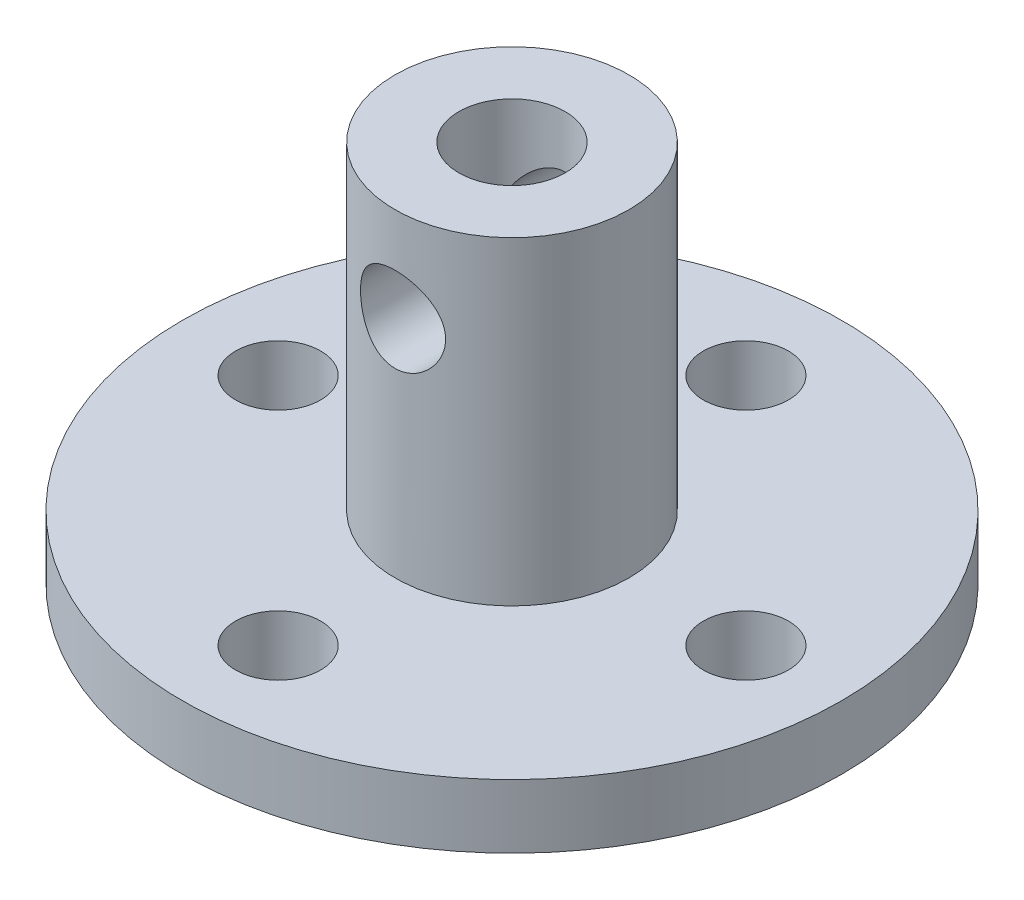
ISO-10303-21;
HEADER;
FILE_DESCRIPTION(('STEP AP214'),'2;1');
FILE_NAME('part.step','',(''),(''),'','','');
FILE_SCHEMA(('AUTOMOTIVE_DESIGN { 1 0 10303 214 1 1 1 1 }'));
ENDSEC;
DATA;
#1=APPLICATION_CONTEXT('core data for automotive mechanical design processes');
#2=APPLICATION_PROTOCOL_DEFINITION('international standard','automotive_design',2000,#1);
#3=PRODUCT_CONTEXT('',#1,'mechanical');
#4=PRODUCT('Part','Part','',(#3));
#5=PRODUCT_RELATED_PRODUCT_CATEGORY('part','',(#4));
#6=PRODUCT_DEFINITION_FORMATION('','',#4);
#7=PRODUCT_DEFINITION_CONTEXT('part definition',#1,'design');
#8=PRODUCT_DEFINITION('design','',#6,#7);
#9=PRODUCT_DEFINITION_SHAPE('','',#8);
#10=(LENGTH_UNIT() NAMED_UNIT(*) SI_UNIT(.MILLI.,.METRE.));
#11=(NAMED_UNIT(*) PLANE_ANGLE_UNIT() SI_UNIT($,.RADIAN.));
#12=(NAMED_UNIT(*) SI_UNIT($,.STERADIAN.) SOLID_ANGLE_UNIT());
#13=UNCERTAINTY_MEASURE_WITH_UNIT(LENGTH_MEASURE(1.E-05),#10,'distance_accuracy_value','');
#14=(GEOMETRIC_REPRESENTATION_CONTEXT(3) GLOBAL_UNCERTAINTY_ASSIGNED_CONTEXT((#13)) GLOBAL_UNIT_ASSIGNED_CONTEXT((#10,
#11,#12)) REPRESENTATION_CONTEXT('',''));
#15=CARTESIAN_POINT('',(0.,0.,0.));
#16=DIRECTION('',(0.,0.,1.));
#17=DIRECTION('',(1.,0.,0.));
#18=AXIS2_PLACEMENT_3D('',#15,#16,#17);
#19=CARTESIAN_POINT('',(2.68671952937225E-13,-76.9507056928012,0.));
#20=DIRECTION('',(0.,-1.,0.));
#21=DIRECTION('',(1.,0.,0.));
#22=AXIS2_PLACEMENT_3D('',#19,#20,#21);
#23=CYLINDRICAL_SURFACE('',#22,2.50000000000003);
#24=CARTESIAN_POINT('',(0.,0.,0.));
#25=DIRECTION('',(0.,-1.,0.));
#26=DIRECTION('',(1.,0.,0.));
#27=AXIS2_PLACEMENT_3D('',#24,#25,#26);
#28=CIRCLE('',#27,2.5);
#29=CARTESIAN_POINT('',(2.5,0.,0.));
#30=VERTEX_POINT('',#29);
#31=EDGE_CURVE('E10',#30,#30,#28,.T.);
#32=ORIENTED_EDGE('',*,*,#31,.F.);
#33=EDGE_LOOP('',(#32));
#34=FACE_BOUND('',#33,.T.);
#35=CARTESIAN_POINT('',(0.,-18.,0.));
#36=DIRECTION('',(0.,-1.,0.));
#37=DIRECTION('',(1.,0.,0.));
#38=AXIS2_PLACEMENT_3D('',#35,#36,#37);
#39=CIRCLE('',#38,2.50000000000006);
#40=CARTESIAN_POINT('',(2.50000000000012,-18.,0.));
#41=VERTEX_POINT('',#40);
#42=EDGE_CURVE('E43',#41,#41,#39,.T.);
#43=ORIENTED_EDGE('',*,*,#42,.T.);
#44=EDGE_LOOP('',(#43));
#45=FACE_BOUND('',#44,.T.);
#46=CARTESIAN_POINT('',(-2.,-4.46288305986519,-1.50000000000003));
#47=CARTESIAN_POINT('',(-1.9999899563842,-4.53796407725375,-1.50002275759913));
#48=CARTESIAN_POINT('',(-1.99572243014959,-4.61316198595881,-1.50575588676019));
#49=CARTESIAN_POINT('',(-1.97904350434638,-4.76119758929481,-1.52759797098304));
#50=CARTESIAN_POINT('',(-1.96660415938923,-4.83402628167732,-1.54374252679466));
#51=CARTESIAN_POINT('',(-1.9288828901246,-5.00048847937374,-1.59078313764403));
#52=CARTESIAN_POINT('',(-1.90063587852784,-5.09252556696474,-1.62485949442397));
#53=CARTESIAN_POINT('',(-1.83286412912235,-5.26885120002648,-1.70094533012845));
#54=CARTESIAN_POINT('',(-1.79330760683741,-5.35311700953233,-1.74297705283047));
#55=CARTESIAN_POINT('',(-1.68777756612173,-5.5432227166457,-1.8462496665938));
#56=CARTESIAN_POINT('',(-1.61742363711761,-5.64584963399247,-1.90894188114931));
#57=CARTESIAN_POINT('',(-1.4586193506474,-5.83685989507741,-2.03287996747904));
#58=CARTESIAN_POINT('',(-1.37018407682201,-5.92525500197909,-2.09412699764472));
#59=CARTESIAN_POINT('',(-1.19476026278807,-6.06998797944266,-2.19790674394512));
#60=CARTESIAN_POINT('',(-1.1109337614669,-6.12920934254926,-2.24174680788009));
#61=CARTESIAN_POINT('',(-0.932444755507568,-6.23524901983149,-2.32165152523269));
#62=CARTESIAN_POINT('',(-0.837799422094955,-6.28208660806607,-2.3577282450037));
#63=CARTESIAN_POINT('',(-0.655317082222552,-6.35459602044585,-2.4141564469638));
#64=CARTESIAN_POINT('',(-0.568853585755697,-6.38246562444131,-2.43610736091395));
#65=CARTESIAN_POINT('',(-0.391188052921992,-6.42638175511919,-2.47085912284982));
#66=CARTESIAN_POINT('',(-0.299988637312624,-6.44243474777524,-2.48366497483989));
#67=CARTESIAN_POINT('',(-0.115048335136527,-6.46174115315533,-2.4990796888362));
#68=CARTESIAN_POINT('',(-0.0212997713727004,-6.46495025255384,-2.50165324772144));
#69=CARTESIAN_POINT('',(0.165416366428143,-6.45821882499301,-2.4962693614476));
#70=CARTESIAN_POINT('',(0.258383904122236,-6.44827768949665,-2.48831142893581));
#71=CARTESIAN_POINT('',(0.435683568436102,-6.41681507355215,-2.46328365713483));
#72=CARTESIAN_POINT('',(0.520210188917503,-6.39595424290912,-2.44673404857184));
#73=CARTESIAN_POINT('',(0.684171862172431,-6.34418782561296,-2.40604493660587));
#74=CARTESIAN_POINT('',(0.763605624129775,-6.31327970436763,-2.38190351809571));
#75=CARTESIAN_POINT('',(0.923527318234439,-6.23928236127668,-2.32486221996815));
#76=CARTESIAN_POINT('',(1.00337969293305,-6.19530654385049,-2.29134265660259));
#77=CARTESIAN_POINT('',(1.15470891362337,-6.09834520027349,-2.21894043646483));
#78=CARTESIAN_POINT('',(1.22618103296473,-6.04535463050211,-2.18005477975516));
#79=CARTESIAN_POINT('',(1.37426521356107,-5.91982119106634,-2.09053510980245));
#80=CARTESIAN_POINT('',(1.44890108738508,-5.84549944566032,-2.03913144290371));
#81=CARTESIAN_POINT('',(1.58538384993672,-5.68662715621444,-1.93492377925715));
#82=CARTESIAN_POINT('',(1.64721494436041,-5.60206418119092,-1.88211814269107));
#83=CARTESIAN_POINT('',(1.75228528490805,-5.43166286404726,-1.78441317626442));
#84=CARTESIAN_POINT('',(1.79674173995946,-5.34673211935148,-1.73924224553805));
#85=CARTESIAN_POINT('',(1.87389106987979,-5.16851659353066,-1.65582105773215));
#86=CARTESIAN_POINT('',(1.90660965872838,-5.07525063952755,-1.61755576516695));
#87=CARTESIAN_POINT('',(1.95062199735974,-4.91009145583743,-1.5639380514333));
#88=CARTESIAN_POINT('',(1.96540293714784,-4.84027022896728,-1.54515601955463));
#89=CARTESIAN_POINT('',(1.98746978122375,-4.69770285391102,-1.51667304681107));
#90=CARTESIAN_POINT('',(1.99477239579985,-4.62496360595451,-1.5069518639038));
#91=CARTESIAN_POINT('',(2.0012999442642,-4.47801968193779,-1.49827790293916));
#92=CARTESIAN_POINT('',(2.00047806264257,-4.40380897480772,-1.4993875344558));
#93=CARTESIAN_POINT('',(1.99072610261057,-4.25683573482774,-1.5123045618576));
#94=CARTESIAN_POINT('',(1.98178458332098,-4.1840753934777,-1.52412705251972));
#95=CARTESIAN_POINT('',(1.95331430449203,-4.02381985720333,-1.56051508430781));
#96=CARTESIAN_POINT('',(1.93167092890879,-3.93728479173431,-1.58755721486236));
#97=CARTESIAN_POINT('',(1.87841388450523,-3.77059219377967,-1.65022809339816));
#98=CARTESIAN_POINT('',(1.84677049067314,-3.69045457896204,-1.68588236549098));
#99=CARTESIAN_POINT('',(1.75807608919813,-3.50135413051584,-1.77903249993897));
#100=CARTESIAN_POINT('',(1.69602510944927,-3.39598772553998,-1.83905564347532));
#101=CARTESIAN_POINT('',(1.55438039564653,-3.19849891062313,-1.96026853157691));
#102=CARTESIAN_POINT('',(1.47476601547357,-3.10639230018168,-2.02145957104437));
#103=CARTESIAN_POINT('',(1.29702304107536,-2.93542025252011,-2.13993299259165));
#104=CARTESIAN_POINT('',(1.19864860522957,-2.85676043075208,-2.19714788259668));
#105=CARTESIAN_POINT('',(0.984970277741255,-2.71761653242097,-2.30083046289381));
#106=CARTESIAN_POINT('',(0.869723203455124,-2.65707345419453,-2.34733292440647));
#107=CARTESIAN_POINT('',(0.664531994140901,-2.57439247239828,-2.41163161860488));
#108=CARTESIAN_POINT('',(0.578408265123262,-2.54616568289106,-2.43384921549891));
#109=CARTESIAN_POINT('',(0.401365381235558,-2.5014509249012,-2.46921550391518));
#110=CARTESIAN_POINT('',(0.310449944178986,-2.48495399532457,-2.48237111815077));
#111=CARTESIAN_POINT('',(0.125961358052232,-2.46469023576049,-2.49854699723998));
#112=CARTESIAN_POINT('',(0.0323797561453786,-2.46096985480688,-2.50153028039162));
#113=CARTESIAN_POINT('',(-0.154129494971622,-2.46664956913042,-2.49698719993363));
#114=CARTESIAN_POINT('',(-0.247057097671256,-2.4760505882735,-2.48946009629713));
#115=CARTESIAN_POINT('',(-0.424484983307911,-2.50648660695642,-2.46524008405097));
#116=CARTESIAN_POINT('',(-0.509170159101682,-2.52687239126805,-2.44905900306102));
#117=CARTESIAN_POINT('',(-0.67352054235681,-2.57773648117868,-2.40905201963011));
#118=CARTESIAN_POINT('',(-0.753184443303591,-2.60821740069124,-2.3852241372675));
#119=CARTESIAN_POINT('',(-0.913383591851932,-2.68125760425779,-2.32886203207214));
#120=CARTESIAN_POINT('',(-0.993310088154036,-2.72467690197622,-2.29572397002092));
#121=CARTESIAN_POINT('',(-1.14486396126312,-2.82052539695987,-2.22403396009592));
#122=CARTESIAN_POINT('',(-1.21648689776314,-2.87295937793373,-2.18547913977515));
#123=CARTESIAN_POINT('',(-1.36488223995404,-2.99717927286894,-2.09666852429869));
#124=CARTESIAN_POINT('',(-1.43970803793646,-3.07072947318067,-2.04563299169991));
#125=CARTESIAN_POINT('',(-1.57669353079996,-3.22799998538866,-1.94201312920058));
#126=CARTESIAN_POINT('',(-1.63883728583059,-3.31173288747061,-1.88942694411831));
#127=CARTESIAN_POINT('',(-1.74551261366345,-3.48184060439486,-1.79109125321809));
#128=CARTESIAN_POINT('',(-1.79106140064663,-3.56745558108134,-1.74513263017546));
#129=CARTESIAN_POINT('',(-1.87016304685233,-3.74727494811662,-1.66007449903139));
#130=CARTESIAN_POINT('',(-1.90373836359647,-3.84146283790299,-1.62096222081731));
#131=CARTESIAN_POINT('',(-1.9491413992244,-4.00902238661791,-1.56580101941139));
#132=CARTESIAN_POINT('',(-1.96446470848964,-4.08030260427244,-1.54635220628735));
#133=CARTESIAN_POINT('',(-1.98726282623962,-4.22590733083612,-1.51695472225643));
#134=CARTESIAN_POINT('',(-1.99476751139894,-4.3002191151432,-1.50696990066828));
#135=CARTESIAN_POINT('',(-1.99935742227831,-4.40420827420756,-1.50085460132405));
#136=CARTESIAN_POINT('',(-2.00000392566845,-4.43353673810868,-1.49999110491777));
#137=CARTESIAN_POINT('',(-2.,-4.46288305986519,-1.50000000000003));
#138=B_SPLINE_CURVE_WITH_KNOTS('',3,(#46,#47,#48,#49,#50,#51,#52,#53,#54,#55,#56,#57,#58,#59,
#60,#61,#62,#63,#64,#65,#66,#67,#68,#69,#70,#71,#72,#73,#74,#75,#76,#77,#78,#79,#80,#81,#82,#83,
#84,#85,#86,#87,#88,#89,#90,#91,#92,#93,#94,#95,#96,#97,#98,#99,#100,#101,#102,#103,#104,#105,
#106,#107,#108,#109,#110,#111,#112,#113,#114,#115,#116,#117,#118,#119,#120,#121,#122,#123,#124,
#125,#126,#127,#128,#129,#130,#131,#132,#133,#134,#135,#136,#137),.UNSPECIFIED.,.T.,.F.,(4,2,2,
2,2,2,2,2,2,2,2,2,2,2,2,2,2,2,2,2,2,2,2,2,2,2,2,2,2,2,2,2,2,2,2,2,2,2,2,2,2,2,2,2,2,4),(0.,
0.225140818813288,0.45105559389501,0.75571438466087,1.06123795594963,1.47720804611672,
1.89283253536878,2.22639303179096,2.55943127851024,2.83862094435178,3.11765772560939,
3.39765639927928,3.67766803055209,3.94241917501297,4.20723715914626,4.49756510688428,
4.78805602626153,5.13841226546405,5.48919811771067,5.80619193384967,6.12248701337037,
6.34307726284838,6.56317352160418,6.78453876949458,7.00621641426762,7.28428560377199,
7.56318925297419,7.96975811975673,8.37680748728577,8.78961174948159,9.2010566025985,
9.47985927613156,9.75844872724258,10.0380499218878,10.3176708039936,10.5823344198312,
10.8470666181457,11.1364335884203,11.4259545900795,11.7747351905783,12.1239515037795,
12.4449574092071,12.7653580273016,12.9909138326702,13.2156045429056,13.3036035490356),.UNSPECIFIED.);
#139=CARTESIAN_POINT('',(-2.,-4.46288305986519,-1.50000000000003));
#140=VERTEX_POINT('',#139);
#141=EDGE_CURVE('E72',#140,#140,#138,.T.);
#142=ORIENTED_EDGE('',*,*,#141,.F.);
#143=EDGE_LOOP('',(#142));
#144=FACE_BOUND('',#143,.T.);
#145=CARTESIAN_POINT('',(-2.,-4.46288305986519,1.50000000000003));
#146=CARTESIAN_POINT('',(-1.9999899563842,-4.38780204247663,1.50002275759913));
#147=CARTESIAN_POINT('',(-1.99572243014959,-4.31260413377157,1.5057558867602));
#148=CARTESIAN_POINT('',(-1.97904350434638,-4.16456853043557,1.52759797098305));
#149=CARTESIAN_POINT('',(-1.96660415938922,-4.09173983805305,1.54374252679467));
#150=CARTESIAN_POINT('',(-1.92888289012459,-3.92527764035663,1.59078313764404));
#151=CARTESIAN_POINT('',(-1.90063587852783,-3.83324055276563,1.62485949442398));
#152=CARTESIAN_POINT('',(-1.83286412912234,-3.65691491970389,1.70094533012846));
#153=CARTESIAN_POINT('',(-1.7933076068374,-3.57264911019804,1.74297705283049));
#154=CARTESIAN_POINT('',(-1.68777756612172,-3.38254340308466,1.84624966659382));
#155=CARTESIAN_POINT('',(-1.61742363711759,-3.27991648573789,1.90894188114933));
#156=CARTESIAN_POINT('',(-1.45861935064738,-3.08890622465296,2.03287996747907));
#157=CARTESIAN_POINT('',(-1.37018407682199,-3.00051111775128,2.09412699764474));
#158=CARTESIAN_POINT('',(-1.19476026278805,-2.85577814028771,2.19790674394514));
#159=CARTESIAN_POINT('',(-1.11093376146688,-2.79655677718111,2.24174680788011));
#160=CARTESIAN_POINT('',(-0.932444755507547,-2.69051709989888,2.32165152523271));
#161=CARTESIAN_POINT('',(-0.837799422094935,-2.64367951166431,2.35772824500371));
#162=CARTESIAN_POINT('',(-0.655317082222532,-2.57117009928453,2.41415644696381));
#163=CARTESIAN_POINT('',(-0.568853585755677,-2.54330049528907,2.43610736091396));
#164=CARTESIAN_POINT('',(-0.391188052921973,-2.49938436461119,2.47085912284982));
#165=CARTESIAN_POINT('',(-0.299988637312604,-2.48333137195514,2.48366497483989));
#166=CARTESIAN_POINT('',(-0.115048335136508,-2.46402496657505,2.4990796888362));
#167=CARTESIAN_POINT('',(-0.0212997713726818,-2.46081586717655,2.50165324772144));
#168=CARTESIAN_POINT('',(0.16541636642816,-2.46754729473738,2.4962693614476));
#169=CARTESIAN_POINT('',(0.258383904122252,-2.47748843023374,2.4883114289358));
#170=CARTESIAN_POINT('',(0.435683568436118,-2.50895104617824,2.46328365713483));
#171=CARTESIAN_POINT('',(0.520210188917519,-2.52981187682127,2.44673404857184));
#172=CARTESIAN_POINT('',(0.684171862172446,-2.58157829411743,2.40604493660586));
#173=CARTESIAN_POINT('',(0.76360562412979,-2.61248641536277,2.3819035180957));
#174=CARTESIAN_POINT('',(0.923527318234453,-2.68648375845372,2.32486221996814));
#175=CARTESIAN_POINT('',(1.00337969293307,-2.7304595758799,2.29134265660258));
#176=CARTESIAN_POINT('',(1.15470891362338,-2.82742091945691,2.21894043646482));
#177=CARTESIAN_POINT('',(1.22618103296475,-2.88041148922829,2.18005477975514));
#178=CARTESIAN_POINT('',(1.37426521356109,-3.00594492866406,2.09053510980244));
#179=CARTESIAN_POINT('',(1.44890108738509,-3.08026667407008,2.03913144290369));
#180=CARTESIAN_POINT('',(1.58538384993673,-3.23913896351596,1.93492377925713));
#181=CARTESIAN_POINT('',(1.64721494436042,-3.32370193853949,1.88211814269105));
#182=CARTESIAN_POINT('',(1.75228528490806,-3.49410325568314,1.7844131762644));
#183=CARTESIAN_POINT('',(1.79674173995947,-3.57903400037892,1.73924224553803));
#184=CARTESIAN_POINT('',(1.87389106987979,-3.75724952619974,1.65582105773213));
#185=CARTESIAN_POINT('',(1.90660965872838,-3.85051548020285,1.61755576516694));
#186=CARTESIAN_POINT('',(1.95062199735975,-4.01567466389296,1.5639380514333));
#187=CARTESIAN_POINT('',(1.96540293714784,-4.08549589076311,1.54515601955462));
#188=CARTESIAN_POINT('',(1.98746978122376,-4.22806326581936,1.51667304681107));
#189=CARTESIAN_POINT('',(1.99477239579985,-4.30080251377587,1.5069518639038));
#190=CARTESIAN_POINT('',(2.0012999442642,-4.44774643779259,1.49827790293916));
#191=CARTESIAN_POINT('',(2.00047806264257,-4.52195714492266,1.4993875344558));
#192=CARTESIAN_POINT('',(1.99072610261057,-4.66893038490263,1.5123045618576));
#193=CARTESIAN_POINT('',(1.98178458332098,-4.74169072625267,1.52412705251972));
#194=CARTESIAN_POINT('',(1.95331430449203,-4.90194626252704,1.56051508430781));
#195=CARTESIAN_POINT('',(1.93167092890879,-4.98848132799606,1.58755721486236));
#196=CARTESIAN_POINT('',(1.87841388450524,-5.1551739259507,1.65022809339816));
#197=CARTESIAN_POINT('',(1.84677049067315,-5.23531154076833,1.68588236549098));
#198=CARTESIAN_POINT('',(1.75807608919814,-5.42441198921452,1.77903249993897));
#199=CARTESIAN_POINT('',(1.69602510944929,-5.52977839419039,1.83905564347531));
#200=CARTESIAN_POINT('',(1.55438039564655,-5.72726720910724,1.96026853157691));
#201=CARTESIAN_POINT('',(1.47476601547359,-5.81937381954868,2.02145957104437));
#202=CARTESIAN_POINT('',(1.29702304107538,-5.99034586721026,2.13993299259164));
#203=CARTESIAN_POINT('',(1.1986486052296,-6.06900568897829,2.19714788259667));
#204=CARTESIAN_POINT('',(0.984970277741286,-6.2081495873094,2.3008304628938));
#205=CARTESIAN_POINT('',(0.869723203455157,-6.26869266553584,2.34733292440646));
#206=CARTESIAN_POINT('',(0.664531994140937,-6.35137364733209,2.41163161860487));
#207=CARTESIAN_POINT('',(0.578408265123299,-6.37960043683931,2.4338492154989));
#208=CARTESIAN_POINT('',(0.401365381235595,-6.42431519482918,2.46921550391517));
#209=CARTESIAN_POINT('',(0.310449944179023,-6.44081212440581,2.48237111815076));
#210=CARTESIAN_POINT('',(0.125961358052267,-6.46107588396989,2.49854699723998));
#211=CARTESIAN_POINT('',(0.0323797561454138,-6.4647962649235,2.50153028039162));
#212=CARTESIAN_POINT('',(-0.154129494971588,-6.45911655059997,2.49698719993363));
#213=CARTESIAN_POINT('',(-0.247057097671223,-6.44971553145689,2.48946009629713));
#214=CARTESIAN_POINT('',(-0.424484983307879,-6.41927951277397,2.46524008405097));
#215=CARTESIAN_POINT('',(-0.50917015910165,-6.39889372846234,2.44905900306102));
#216=CARTESIAN_POINT('',(-0.673520542356779,-6.34802963855171,2.40905201963012));
#217=CARTESIAN_POINT('',(-0.75318444330356,-6.31754871903916,2.38522413726751));
#218=CARTESIAN_POINT('',(-0.913383591851903,-6.24450851547262,2.32886203207214));
#219=CARTESIAN_POINT('',(-0.993310088154007,-6.20108921775418,2.29572397002092));
#220=CARTESIAN_POINT('',(-1.14486396126309,-6.10524072277054,2.22403396009593));
#221=CARTESIAN_POINT('',(-1.21648689776312,-6.05280674179667,2.18547913977516));
#222=CARTESIAN_POINT('',(-1.36488223995401,-5.92858684686147,2.0966685242987));
#223=CARTESIAN_POINT('',(-1.43970803793644,-5.85503664654974,2.04563299169992));
#224=CARTESIAN_POINT('',(-1.57669353079994,-5.69776613434176,1.94201312920059));
#225=CARTESIAN_POINT('',(-1.63883728583057,-5.61403323225981,1.88942694411833));
#226=CARTESIAN_POINT('',(-1.74551261366343,-5.44392551533556,1.79109125321811));
#227=CARTESIAN_POINT('',(-1.79106140064661,-5.35831053864908,1.74513263017548));
#228=CARTESIAN_POINT('',(-1.87016304685232,-5.17849117161379,1.66007449903139));
#229=CARTESIAN_POINT('',(-1.90373836359646,-5.08430328182742,1.62096222081731));
#230=CARTESIAN_POINT('',(-1.94914139922439,-4.9167437331125,1.5658010194114));
#231=CARTESIAN_POINT('',(-1.96446470848964,-4.84546351545797,1.54635220628735));
#232=CARTESIAN_POINT('',(-1.98726282623962,-4.69985878889431,1.51695472225643));
#233=CARTESIAN_POINT('',(-1.99476751139894,-4.62554700458723,1.50696990066828));
#234=CARTESIAN_POINT('',(-1.99935742227831,-4.52155784552285,1.50085460132405));
#235=CARTESIAN_POINT('',(-2.00000392566845,-4.49222938162172,1.49999110491777));
#236=CARTESIAN_POINT('',(-2.,-4.46288305986519,1.50000000000003));
#237=B_SPLINE_CURVE_WITH_KNOTS('',3,(#145,#146,#147,#148,#149,#150,#151,#152,#153,#154,#155,
#156,#157,#158,#159,#160,#161,#162,#163,#164,#165,#166,#167,#168,#169,#170,#171,#172,#173,#174,
#175,#176,#177,#178,#179,#180,#181,#182,#183,#184,#185,#186,#187,#188,#189,#190,#191,#192,#193,
#194,#195,#196,#197,#198,#199,#200,#201,#202,#203,#204,#205,#206,#207,#208,#209,#210,#211,#212,
#213,#214,#215,#216,#217,#218,#219,#220,#221,#222,#223,#224,#225,#226,#227,#228,#229,#230,#231,
#232,#233,#234,#235,#236),.UNSPECIFIED.,.T.,.F.,(4,2,2,2,2,2,2,2,2,2,2,2,2,2,2,2,2,2,2,2,2,2,2,
2,2,2,2,2,2,2,2,2,2,2,2,2,2,2,2,2,2,2,2,2,2,4),(0.,0.225140818813297,0.451055593895029,
0.755714384660896,1.06123795594966,1.47720804611676,1.89283253536882,2.22639303179099,
2.55943127851026,2.8386209443518,3.11765772560941,3.3976563992793,3.67766803055211,
3.94241917501299,4.20723715914627,4.4975651068843,4.78805602626155,5.13841226546407,
5.4891981177107,5.80619193384969,6.12248701337038,6.34307726284838,6.56317352160418,
6.78453876949456,7.00621641426759,7.28428560377197,7.56318925297417,7.9697581197567,
8.37680748728573,8.78961174948155,9.20105660259846,9.47985927613153,9.75844872724254,
10.0380499218877,10.3176708039936,10.5823344198312,10.8470666181456,11.1364335884203,
11.4259545900794,11.7747351905783,12.1239515037795,12.4449574092071,12.7653580273015,
12.9909138326702,13.2156045429056,13.3036035490356),.UNSPECIFIED.);
#238=CARTESIAN_POINT('',(-2.,-4.46288305986519,1.50000000000003));
#239=VERTEX_POINT('',#238);
#240=EDGE_CURVE('E77',#239,#239,#237,.T.);
#241=ORIENTED_EDGE('',*,*,#240,.F.);
#242=EDGE_LOOP('',(#241));
#243=FACE_BOUND('',#242,.T.);
#244=ADVANCED_FACE('F31',(#34,#45,#144,#243),#23,.F.);
#245=CARTESIAN_POINT('',(2.68671952937225E-13,-76.9507056928012,0.));
#246=DIRECTION('',(0.,-1.,0.));
#247=DIRECTION('',(1.,0.,0.));
#248=AXIS2_PLACEMENT_3D('',#245,#246,#247);
#249=CYLINDRICAL_SURFACE('',#248,5.50000000000002);
#250=CARTESIAN_POINT('',(0.,-15.,0.));
#251=DIRECTION('',(0.,-1.,0.));
#252=DIRECTION('',(1.,0.,0.));
#253=AXIS2_PLACEMENT_3D('',#250,#251,#252);
#254=CIRCLE('',#253,5.50000000000005);
#255=CARTESIAN_POINT('',(5.5000000000001,-15.,0.));
#256=VERTEX_POINT('',#255);
#257=EDGE_CURVE('E124',#256,#256,#254,.T.);
#258=ORIENTED_EDGE('',*,*,#257,.F.);
#259=EDGE_LOOP('',(#258));
#260=FACE_BOUND('',#259,.T.);
#261=CARTESIAN_POINT('',(0.,0.,0.));
#262=DIRECTION('',(0.,-1.,0.));
#263=DIRECTION('',(1.,0.,0.));
#264=AXIS2_PLACEMENT_3D('',#261,#262,#263);
#265=CIRCLE('',#264,5.5);
#266=CARTESIAN_POINT('',(5.5,0.,0.));
#267=VERTEX_POINT('',#266);
#268=EDGE_CURVE('E126',#267,#267,#265,.T.);
#269=ORIENTED_EDGE('',*,*,#268,.T.);
#270=EDGE_LOOP('',(#269));
#271=FACE_BOUND('',#270,.T.);
#272=CARTESIAN_POINT('',(-2.,-4.46288305986519,-5.12347538297982));
#273=CARTESIAN_POINT('',(-2.00000293004249,-4.35460854004633,-5.12347275124284));
#274=CARTESIAN_POINT('',(-1.99117807280778,-4.24635398615132,-5.12694498493581));
#275=CARTESIAN_POINT('',(-1.95626052376498,-4.03309291966064,-5.14036861337638));
#276=CARTESIAN_POINT('',(-1.93016749279877,-3.92808647090225,-5.15032013538135));
#277=CARTESIAN_POINT('',(-1.86178456784124,-3.72445555448238,-5.17542921474241));
#278=CARTESIAN_POINT('',(-1.81953142504295,-3.62581719516396,-5.19057495144293));
#279=CARTESIAN_POINT('',(-1.72015671965849,-3.43699217727453,-5.2243474119811));
#280=CARTESIAN_POINT('',(-1.6630309913018,-3.34680789630873,-5.24297511069386));
#281=CARTESIAN_POINT('',(-1.53267636473141,-3.17324112326651,-5.28258718364167));
#282=CARTESIAN_POINT('',(-1.4588670457784,-3.09030959924807,-5.30363801656241));
#283=CARTESIAN_POINT('',(-1.29847395090624,-2.93768657980269,-5.34516804915707));
#284=CARTESIAN_POINT('',(-1.21188765990613,-2.86799769731429,-5.3656471353396));
#285=CARTESIAN_POINT('',(-1.02501099836122,-2.74170202241574,-5.40451035360992));
#286=CARTESIAN_POINT('',(-0.924373007095122,-2.6855804118172,-5.42280740918457));
#287=CARTESIAN_POINT('',(-0.714302322619146,-2.59124844190199,-5.45445066356557));
#288=CARTESIAN_POINT('',(-0.604872497713077,-2.55303226857547,-5.46779846913094));
#289=CARTESIAN_POINT('',(-0.385062073334401,-2.49716268539549,-5.48756783205579));
#290=CARTESIAN_POINT('',(-0.274902399081434,-2.47873397977672,-5.49424974471742));
#291=CARTESIAN_POINT('',(-0.0528649522640296,-2.46048368688136,-5.50086592417045));
#292=CARTESIAN_POINT('',(0.0590122843232904,-2.4606564083424,-5.50080225482925));
#293=CARTESIAN_POINT('',(0.275771839144137,-2.4791411085807,-5.49410314529079));
#294=CARTESIAN_POINT('',(0.38073729565743,-2.49660807546605,-5.48777385144894));
#295=CARTESIAN_POINT('',(0.586130568134522,-2.54777085223611,-5.46965132675475));
#296=CARTESIAN_POINT('',(0.686558064853941,-2.581467801958,-5.45785771214353));
#297=CARTESIAN_POINT('',(0.881716621745937,-2.66455418778003,-5.42977365154601));
#298=CARTESIAN_POINT('',(0.97634629148742,-2.71416009472355,-5.41342160655292));
#299=CARTESIAN_POINT('',(1.15616750349392,-2.82746877614193,-5.37788901462662));
#300=CARTESIAN_POINT('',(1.24135609372563,-2.89117594123497,-5.35870758734873));
#301=CARTESIAN_POINT('',(1.40487115253366,-3.03500428935896,-5.31825370520591));
#302=CARTESIAN_POINT('',(1.48255722943363,-3.11583857651957,-5.29692427580931));
#303=CARTESIAN_POINT('',(1.62350275267862,-3.28953245736868,-5.25543998031256));
#304=CARTESIAN_POINT('',(1.68675900801675,-3.3823947038125,-5.2352853747448));
#305=CARTESIAN_POINT('',(1.79817338979411,-3.579892147379,-5.19808646871719));
#306=CARTESIAN_POINT('',(1.84600819097445,-3.68472385151372,-5.18111156119858));
#307=CARTESIAN_POINT('',(1.9231098188622,-3.90173295233282,-5.15299456396796));
#308=CARTESIAN_POINT('',(1.95238623964435,-4.01390652036852,-5.14184946095984));
#309=CARTESIAN_POINT('',(1.99012706465182,-4.23611890906802,-5.12735643414924));
#310=CARTESIAN_POINT('',(1.99960222005341,-4.34596127008583,-5.12363032042966));
#311=CARTESIAN_POINT('',(2.0003729322056,-4.56570576465743,-5.12333014498255));
#312=CARTESIAN_POINT('',(1.99167265312223,-4.67560787875379,-5.12675444502669));
#313=CARTESIAN_POINT('',(1.9572538500743,-4.88734064074668,-5.13998707932391));
#314=CARTESIAN_POINT('',(1.932293376511,-4.9893143261284,-5.14951074215578));
#315=CARTESIAN_POINT('',(1.86700383745764,-5.18758755045696,-5.17353825947005));
#316=CARTESIAN_POINT('',(1.8266717385262,-5.2838859651104,-5.18804309688308));
#317=CARTESIAN_POINT('',(1.73014628242228,-5.47192378093044,-5.22104178436919));
#318=CARTESIAN_POINT('',(1.67343452272377,-5.5633745495747,-5.2396603650913));
#319=CARTESIAN_POINT('',(1.54632097468222,-5.73582253441044,-5.27857021482953));
#320=CARTESIAN_POINT('',(1.4759144402832,-5.81681611032427,-5.29886206232387));
#321=CARTESIAN_POINT('',(1.3184928745526,-5.97099944989349,-5.34027831804471));
#322=CARTESIAN_POINT('',(1.2307433561783,-6.04344753802476,-5.36138127331169));
#323=CARTESIAN_POINT('',(1.0438122274277,-6.17266763571861,-5.40088600164411));
#324=CARTESIAN_POINT('',(0.944630732338443,-6.22943980334718,-5.4192878019454));
#325=CARTESIAN_POINT('',(0.737859865857847,-6.32526909834549,-5.45127914439051));
#326=CARTESIAN_POINT('',(0.63031107270258,-6.36440615069822,-5.46489033553506));
#327=CARTESIAN_POINT('',(0.409553138551497,-6.42383099596393,-5.48584856400874));
#328=CARTESIAN_POINT('',(0.296346502593661,-6.44412705425765,-5.49319834804632));
#329=CARTESIAN_POINT('',(0.0742113093359519,-6.46444288869649,-5.50056012970966));
#330=CARTESIAN_POINT('',(-0.0346088654444596,-6.46551916654871,-5.5009544501537));
#331=CARTESIAN_POINT('',(-0.250810149350176,-6.45005095672138,-5.49534201670208));
#332=CARTESIAN_POINT('',(-0.358191413632609,-6.43350838461144,-5.48933595867304));
#333=CARTESIAN_POINT('',(-0.566097461624117,-6.38400481454263,-5.47176319875059));
#334=CARTESIAN_POINT('',(-0.666720749684611,-6.35141011261415,-5.46032074736637));
#335=CARTESIAN_POINT('',(-0.86108817463765,-6.27108427587691,-5.43306256066777));
#336=CARTESIAN_POINT('',(-0.954831011655945,-6.22335028992948,-5.41724600166193));
#337=CARTESIAN_POINT('',(-1.13696105031525,-6.11187682532003,-5.3820326870137));
#338=CARTESIAN_POINT('',(-1.22497358333261,-6.04756367945348,-5.36251616875209));
#339=CARTESIAN_POINT('',(-1.38928958654362,-5.90568127322789,-5.32231551394999));
#340=CARTESIAN_POINT('',(-1.46558896939243,-5.82810740536071,-5.30163097325242));
#341=CARTESIAN_POINT('',(-1.60813820448701,-5.65739090391186,-5.26019720838333));
#342=CARTESIAN_POINT('',(-1.6737147319106,-5.56367270165559,-5.23949422132874));
#343=CARTESIAN_POINT('',(-1.78819204365537,-5.36589018355296,-5.20154028091868));
#344=CARTESIAN_POINT('',(-1.83709296166334,-5.26182595065838,-5.18428929988925));
#345=CARTESIAN_POINT('',(-1.91724549557285,-5.0441382724028,-5.15519540848634));
#346=CARTESIAN_POINT('',(-1.94815779531079,-4.93037475609555,-5.1434572297848));
#347=CARTESIAN_POINT('',(-1.98952777846176,-4.69869239470361,-5.12760076343701));
#348=CARTESIAN_POINT('',(-1.99999680967408,-4.58077589191866,-5.12347824850096));
#349=CARTESIAN_POINT('',(-2.,-4.46288305986519,-5.12347538297982));
#350=B_SPLINE_CURVE_WITH_KNOTS('',3,(#272,#273,#274,#275,#276,#277,#278,#279,#280,#281,#282,
#283,#284,#285,#286,#287,#288,#289,#290,#291,#292,#293,#294,#295,#296,#297,#298,#299,#300,#301,
#302,#303,#304,#305,#306,#307,#308,#309,#310,#311,#312,#313,#314,#315,#316,#317,#318,#319,#320,
#321,#322,#323,#324,#325,#326,#327,#328,#329,#330,#331,#332,#333,#334,#335,#336,#337,#338,#339,
#340,#341,#342,#343,#344,#345,#346,#347,#348,#349),.UNSPECIFIED.,.T.,.F.,(4,2,2,2,2,2,2,2,2,2,2,
2,2,2,2,2,2,2,2,2,2,2,2,2,2,2,2,2,2,2,2,2,2,2,2,2,2,2,4),(0.,0.324385235377266,0.64877684207972,
0.972435065073585,1.29618404156546,1.63366988764055,1.97122225489986,2.31948370902438,
2.66763200192578,3.00157681867778,3.33541946250728,3.65371703874089,3.9720369723811,
4.29488638598021,4.61783646488796,4.95865365420965,5.29954613884792,5.64718022486077,
5.99463444855926,6.32387056541214,6.6530312593916,6.96784950829477,7.28272991572498,
7.60893794143316,7.93525921974557,8.28082051863008,8.62637833296748,8.97035387486194,
9.31417844625913,9.63904117518343,9.96386858774744,10.2816050472769,10.5994013807848,
10.9301665077848,11.26104679535,11.6080968285023,11.9551440793218,12.3085415361896,
12.6617427707823),.UNSPECIFIED.);
#351=CARTESIAN_POINT('',(-2.,-4.46288305986519,-5.12347538297982));
#352=VERTEX_POINT('',#351);
#353=EDGE_CURVE('E51',#352,#352,#350,.T.);
#354=ORIENTED_EDGE('',*,*,#353,.F.);
#355=EDGE_LOOP('',(#354));
#356=FACE_BOUND('',#355,.T.);
#357=CARTESIAN_POINT('',(-2.,-4.46288305986519,5.12347538297982));
#358=CARTESIAN_POINT('',(-2.00000293004249,-4.57115757968406,5.12347275124284));
#359=CARTESIAN_POINT('',(-1.99117807280778,-4.67941213357907,5.12694498493581));
#360=CARTESIAN_POINT('',(-1.95626052376498,-4.89267320006975,5.14036861337638));
#361=CARTESIAN_POINT('',(-1.93016749279877,-4.99767964882813,5.15032013538135));
#362=CARTESIAN_POINT('',(-1.86178456784124,-5.201310565248,5.17542921474241));
#363=CARTESIAN_POINT('',(-1.81953142504295,-5.29994892456642,5.19057495144292));
#364=CARTESIAN_POINT('',(-1.72015671965849,-5.48877394245586,5.2243474119811));
#365=CARTESIAN_POINT('',(-1.66303099130181,-5.57895822342165,5.24297511069386));
#366=CARTESIAN_POINT('',(-1.53267636473142,-5.75252499646388,5.28258718364166));
#367=CARTESIAN_POINT('',(-1.45886704577841,-5.83545652048232,5.30363801656241));
#368=CARTESIAN_POINT('',(-1.29847395090625,-5.98807953992769,5.34516804915707));
#369=CARTESIAN_POINT('',(-1.21188765990613,-6.0577684224161,5.36564713533959));
#370=CARTESIAN_POINT('',(-1.02501099836122,-6.18406409731464,5.40451035360991));
#371=CARTESIAN_POINT('',(-0.924373007095126,-6.24018570791319,5.42280740918456));
#372=CARTESIAN_POINT('',(-0.71430232261915,-6.33451767782839,5.45445066356557));
#373=CARTESIAN_POINT('',(-0.604872497713081,-6.37273385115491,5.46779846913094));
#374=CARTESIAN_POINT('',(-0.385062073334405,-6.4286034343349,5.48756783205578));
#375=CARTESIAN_POINT('',(-0.274902399081438,-6.44703213995366,5.49424974471741));
#376=CARTESIAN_POINT('',(-0.0528649522640337,-6.46528243284903,5.50086592417045));
#377=CARTESIAN_POINT('',(0.0590122843232863,-6.46510971138799,5.50080225482925));
#378=CARTESIAN_POINT('',(0.275771839144133,-6.44662501114969,5.49410314529079));
#379=CARTESIAN_POINT('',(0.380737295657426,-6.42915804426434,5.48777385144894));
#380=CARTESIAN_POINT('',(0.586130568134519,-6.37799526749428,5.46965132675475));
#381=CARTESIAN_POINT('',(0.686558064853938,-6.34429831777239,5.45785771214354));
#382=CARTESIAN_POINT('',(0.881716621745933,-6.26121193195036,5.42977365154602));
#383=CARTESIAN_POINT('',(0.976346291487415,-6.21160602500684,5.41342160655292));
#384=CARTESIAN_POINT('',(1.15616750349392,-6.09829734358846,5.37788901462662));
#385=CARTESIAN_POINT('',(1.24135609372563,-6.03459017849542,5.35870758734874));
#386=CARTESIAN_POINT('',(1.40487115253366,-5.89076183037144,5.31825370520591));
#387=CARTESIAN_POINT('',(1.48255722943363,-5.80992754321082,5.29692427580932));
#388=CARTESIAN_POINT('',(1.62350275267861,-5.63623366236171,5.25543998031256));
#389=CARTESIAN_POINT('',(1.68675900801674,-5.54337141591789,5.2352853747448));
#390=CARTESIAN_POINT('',(1.79817338979411,-5.34587397235139,5.19808646871719));
#391=CARTESIAN_POINT('',(1.84600819097445,-5.24104226821667,5.18111156119858));
#392=CARTESIAN_POINT('',(1.9231098188622,-5.02403316739757,5.15299456396797));
#393=CARTESIAN_POINT('',(1.95238623964435,-4.91185959936187,5.14184946095984));
#394=CARTESIAN_POINT('',(1.99012706465182,-4.68964721066237,5.12735643414924));
#395=CARTESIAN_POINT('',(1.99960222005341,-4.57980484964457,5.12363032042966));
#396=CARTESIAN_POINT('',(2.0003729322056,-4.36006035507296,5.12333014498255));
#397=CARTESIAN_POINT('',(1.99167265312223,-4.2501582409766,5.12675444502669));
#398=CARTESIAN_POINT('',(1.95725385007431,-4.03842547898372,5.13998707932391));
#399=CARTESIAN_POINT('',(1.932293376511,-3.93645179360199,5.14951074215577));
#400=CARTESIAN_POINT('',(1.86700383745764,-3.73817856927343,5.17353825947005));
#401=CARTESIAN_POINT('',(1.8266717385262,-3.64188015461999,5.18804309688307));
#402=CARTESIAN_POINT('',(1.73014628242229,-3.45384233879995,5.22104178436919));
#403=CARTESIAN_POINT('',(1.67343452272378,-3.36239157015569,5.2396603650913));
#404=CARTESIAN_POINT('',(1.54632097468222,-3.18994358531995,5.27857021482953));
#405=CARTESIAN_POINT('',(1.4759144402832,-3.10895000940612,5.29886206232387));
#406=CARTESIAN_POINT('',(1.3184928745526,-2.9547666698369,5.34027831804471));
#407=CARTESIAN_POINT('',(1.23074335617831,-2.88231858170563,5.36138127331169));
#408=CARTESIAN_POINT('',(1.0438122274277,-2.75309848401178,5.40088600164411));
#409=CARTESIAN_POINT('',(0.944630732338448,-2.69632631638321,5.4192878019454));
#410=CARTESIAN_POINT('',(0.737859865857852,-2.6004970213849,5.4512791443905));
#411=CARTESIAN_POINT('',(0.630311072702585,-2.56135996903217,5.46489033553506));
#412=CARTESIAN_POINT('',(0.409553138551502,-2.50193512376646,5.48584856400874));
#413=CARTESIAN_POINT('',(0.296346502593665,-2.48163906547273,5.49319834804632));
#414=CARTESIAN_POINT('',(0.0742113093359562,-2.4613232310339,5.50056012970966));
#415=CARTESIAN_POINT('',(-0.0346088654444552,-2.46024695318167,5.5009544501537));
#416=CARTESIAN_POINT('',(-0.250810149350172,-2.475715163009,5.49534201670208));
#417=CARTESIAN_POINT('',(-0.358191413632605,-2.49225773511894,5.48933595867305));
#418=CARTESIAN_POINT('',(-0.566097461624114,-2.54176130518776,5.47176319875059));
#419=CARTESIAN_POINT('',(-0.666720749684608,-2.57435600711623,5.46032074736637));
#420=CARTESIAN_POINT('',(-0.861088174637646,-2.65468184385348,5.43306256066777));
#421=CARTESIAN_POINT('',(-0.954831011655942,-2.70241582980091,5.41724600166193));
#422=CARTESIAN_POINT('',(-1.13696105031524,-2.81388929441035,5.38203268701371));
#423=CARTESIAN_POINT('',(-1.2249735833326,-2.8782024402769,5.36251616875209));
#424=CARTESIAN_POINT('',(-1.38928958654361,-3.02008484650249,5.32231551395));
#425=CARTESIAN_POINT('',(-1.46558896939243,-3.09765871436968,5.30163097325242));
#426=CARTESIAN_POINT('',(-1.60813820448701,-3.26837521581853,5.26019720838333));
#427=CARTESIAN_POINT('',(-1.67371473191059,-3.36209341807479,5.23949422132874));
#428=CARTESIAN_POINT('',(-1.78819204365536,-3.55987593617742,5.20154028091868));
#429=CARTESIAN_POINT('',(-1.83709296166334,-3.663940169072,5.18428929988925));
#430=CARTESIAN_POINT('',(-1.91724549557285,-3.88162784732759,5.15519540848635));
#431=CARTESIAN_POINT('',(-1.94815779531079,-3.99539136363483,5.1434572297848));
#432=CARTESIAN_POINT('',(-1.98952777846176,-4.22707372502678,5.12760076343701));
#433=CARTESIAN_POINT('',(-1.99999680967408,-4.34499022781173,5.12347824850096));
#434=CARTESIAN_POINT('',(-2.,-4.46288305986519,5.12347538297982));
#435=B_SPLINE_CURVE_WITH_KNOTS('',3,(#357,#358,#359,#360,#361,#362,#363,#364,#365,#366,#367,
#368,#369,#370,#371,#372,#373,#374,#375,#376,#377,#378,#379,#380,#381,#382,#383,#384,#385,#386,
#387,#388,#389,#390,#391,#392,#393,#394,#395,#396,#397,#398,#399,#400,#401,#402,#403,#404,#405,
#406,#407,#408,#409,#410,#411,#412,#413,#414,#415,#416,#417,#418,#419,#420,#421,#422,#423,#424,
#425,#426,#427,#428,#429,#430,#431,#432,#433,#434),.UNSPECIFIED.,.T.,.F.,(4,2,2,2,2,2,2,2,2,2,2,
2,2,2,2,2,2,2,2,2,2,2,2,2,2,2,2,2,2,2,2,2,2,2,2,2,2,2,4),(0.,0.324385235377266,
0.648776842079717,0.97243506507358,1.29618404156545,1.63366988764054,1.97122225489985,
2.31948370902438,2.66763200192577,3.00157681867777,3.33541946250727,3.65371703874088,
3.97203697238109,4.29488638598021,4.61783646488796,4.95865365420964,5.29954613884792,
5.64718022486076,5.99463444855926,6.32387056541214,6.6530312593916,6.96784950829476,
7.28272991572498,7.60893794143316,7.93525921974557,8.28082051863007,8.62637833296748,
8.97035387486194,9.31417844625912,9.63904117518342,9.96386858774744,10.2816050472769,
10.5994013807848,10.9301665077848,11.26104679535,11.6080968285023,11.9551440793218,
12.3085415361896,12.6617427707823),.UNSPECIFIED.);
#436=CARTESIAN_POINT('',(-2.,-4.46288305986519,5.12347538297982));
#437=VERTEX_POINT('',#436);
#438=EDGE_CURVE('E35',#437,#437,#435,.T.);
#439=ORIENTED_EDGE('',*,*,#438,.F.);
#440=EDGE_LOOP('',(#439));
#441=FACE_BOUND('',#440,.T.);
#442=ADVANCED_FACE('F56',(#260,#271,#356,#441),#249,.T.);
#443=CARTESIAN_POINT('',(-5.5,0.,0.));
#444=DIRECTION('',(0.,-1.,0.));
#445=DIRECTION('',(1.,0.,0.));
#446=AXIS2_PLACEMENT_3D('',#443,#444,#445);
#447=PLANE('',#446);
#448=ORIENTED_EDGE('',*,*,#268,.F.);
#449=EDGE_LOOP('',(#448));
#450=FACE_BOUND('',#449,.T.);
#451=ORIENTED_EDGE('',*,*,#31,.T.);
#452=EDGE_LOOP('',(#451));
#453=FACE_BOUND('',#452,.T.);
#454=ADVANCED_FACE('F33',(#450,#453),#447,.F.);
#455=CARTESIAN_POINT('',(-2.5,-18.,0.));
#456=DIRECTION('',(0.,1.,0.));
#457=DIRECTION('',(-1.,0.,0.));
#458=AXIS2_PLACEMENT_3D('',#455,#456,#457);
#459=PLANE('',#458);
#460=CARTESIAN_POINT('',(-10.9999999999999,-18.,0.));
#461=DIRECTION('',(0.,1.,0.));
#462=DIRECTION('',(-1.,0.,0.));
#463=AXIS2_PLACEMENT_3D('',#460,#461,#462);
#464=CIRCLE('',#463,2.);
#465=CARTESIAN_POINT('',(-12.9999999999999,-18.,0.));
#466=VERTEX_POINT('',#465);
#467=EDGE_CURVE('E229',#466,#466,#464,.T.);
#468=ORIENTED_EDGE('',*,*,#467,.T.);
#469=EDGE_LOOP('',(#468));
#470=FACE_BOUND('',#469,.T.);
#471=CARTESIAN_POINT('',(0.,-18.,11.));
#472=DIRECTION('',(0.,1.,0.));
#473=DIRECTION('',(-1.,0.,0.));
#474=AXIS2_PLACEMENT_3D('',#471,#472,#473);
#475=CIRCLE('',#474,2.);
#476=CARTESIAN_POINT('',(-1.99999999999994,-18.,11.));
#477=VERTEX_POINT('',#476);
#478=EDGE_CURVE('E231',#477,#477,#475,.T.);
#479=ORIENTED_EDGE('',*,*,#478,.T.);
#480=EDGE_LOOP('',(#479));
#481=FACE_BOUND('',#480,.T.);
#482=CARTESIAN_POINT('',(11.0000000000001,-17.9999999999999,0.));
#483=DIRECTION('',(0.,1.,0.));
#484=DIRECTION('',(-1.,0.,0.));
#485=AXIS2_PLACEMENT_3D('',#482,#483,#484);
#486=CIRCLE('',#485,2.);
#487=CARTESIAN_POINT('',(9.00000000000006,-17.9999999999999,0.));
#488=VERTEX_POINT('',#487);
#489=EDGE_CURVE('E238',#488,#488,#486,.T.);
#490=ORIENTED_EDGE('',*,*,#489,.T.);
#491=EDGE_LOOP('',(#490));
#492=FACE_BOUND('',#491,.T.);
#493=CARTESIAN_POINT('',(0.,-18.,-11.));
#494=DIRECTION('',(0.,1.,0.));
#495=DIRECTION('',(-1.,0.,0.));
#496=AXIS2_PLACEMENT_3D('',#493,#494,#495);
#497=CIRCLE('',#496,2.);
#498=CARTESIAN_POINT('',(-1.99999999999994,-18.,-11.));
#499=VERTEX_POINT('',#498);
#500=EDGE_CURVE('E55',#499,#499,#497,.T.);
#501=ORIENTED_EDGE('',*,*,#500,.T.);
#502=EDGE_LOOP('',(#501));
#503=FACE_BOUND('',#502,.T.);
#504=ORIENTED_EDGE('',*,*,#42,.F.);
#505=EDGE_LOOP('',(#504));
#506=FACE_BOUND('',#505,.T.);
#507=CARTESIAN_POINT('',(0.,-17.9999999999999,0.));
#508=DIRECTION('',(0.,-1.,0.));
#509=DIRECTION('',(1.,0.,0.));
#510=AXIS2_PLACEMENT_3D('',#507,#508,#509);
#511=CIRCLE('',#510,15.5000000000001);
#512=CARTESIAN_POINT('',(15.5000000000001,-17.9999999999999,0.));
#513=VERTEX_POINT('',#512);
#514=EDGE_CURVE('E48',#513,#513,#511,.T.);
#515=ORIENTED_EDGE('',*,*,#514,.T.);
#516=EDGE_LOOP('',(#515));
#517=FACE_BOUND('',#516,.T.);
#518=ADVANCED_FACE('F86',(#470,#481,#492,#503,#506,#517),#459,.F.);
#519=CARTESIAN_POINT('',(2.68671952937225E-13,-76.9507056928012,0.));
#520=DIRECTION('',(0.,-1.,0.));
#521=DIRECTION('',(1.,0.,0.));
#522=AXIS2_PLACEMENT_3D('',#519,#520,#521);
#523=CYLINDRICAL_SURFACE('',#522,15.5000000000001);
#524=ORIENTED_EDGE('',*,*,#514,.F.);
#525=EDGE_LOOP('',(#524));
#526=FACE_BOUND('',#525,.T.);
#527=CARTESIAN_POINT('',(0.,-14.9999999999999,0.));
#528=DIRECTION('',(0.,-1.,0.));
#529=DIRECTION('',(1.,0.,0.));
#530=AXIS2_PLACEMENT_3D('',#527,#528,#529);
#531=CIRCLE('',#530,15.5);
#532=CARTESIAN_POINT('',(15.5000000000001,-14.9999999999999,0.));
#533=VERTEX_POINT('',#532);
#534=EDGE_CURVE('E121',#533,#533,#531,.T.);
#535=ORIENTED_EDGE('',*,*,#534,.T.);
#536=EDGE_LOOP('',(#535));
#537=FACE_BOUND('',#536,.T.);
#538=ADVANCED_FACE('F90',(#526,#537),#523,.T.);
#539=CARTESIAN_POINT('',(-15.5,-15.,0.));
#540=DIRECTION('',(0.,-1.,0.));
#541=DIRECTION('',(1.,0.,0.));
#542=AXIS2_PLACEMENT_3D('',#539,#540,#541);
#543=PLANE('',#542);
#544=CARTESIAN_POINT('',(-10.9999999999999,-15.,0.));
#545=DIRECTION('',(0.,1.,0.));
#546=DIRECTION('',(-1.,0.,0.));
#547=AXIS2_PLACEMENT_3D('',#544,#545,#546);
#548=CIRCLE('',#547,2.);
#549=CARTESIAN_POINT('',(-12.9999999999999,-15.,0.));
#550=VERTEX_POINT('',#549);
#551=EDGE_CURVE('E105',#550,#550,#548,.T.);
#552=ORIENTED_EDGE('',*,*,#551,.F.);
#553=EDGE_LOOP('',(#552));
#554=FACE_BOUND('',#553,.T.);
#555=CARTESIAN_POINT('',(0.,-15.,11.));
#556=DIRECTION('',(0.,1.,0.));
#557=DIRECTION('',(-1.,0.,0.));
#558=AXIS2_PLACEMENT_3D('',#555,#556,#557);
#559=CIRCLE('',#558,2.);
#560=CARTESIAN_POINT('',(-1.99999999999995,-15.,11.));
#561=VERTEX_POINT('',#560);
#562=EDGE_CURVE('E109',#561,#561,#559,.T.);
#563=ORIENTED_EDGE('',*,*,#562,.F.);
#564=EDGE_LOOP('',(#563));
#565=FACE_BOUND('',#564,.T.);
#566=CARTESIAN_POINT('',(11.0000000000001,-14.9999999999999,0.));
#567=DIRECTION('',(0.,1.,0.));
#568=DIRECTION('',(-1.,0.,0.));
#569=AXIS2_PLACEMENT_3D('',#566,#567,#568);
#570=CIRCLE('',#569,2.);
#571=CARTESIAN_POINT('',(9.00000000000005,-14.9999999999999,0.));
#572=VERTEX_POINT('',#571);
#573=EDGE_CURVE('E113',#572,#572,#570,.T.);
#574=ORIENTED_EDGE('',*,*,#573,.F.);
#575=EDGE_LOOP('',(#574));
#576=FACE_BOUND('',#575,.T.);
#577=CARTESIAN_POINT('',(0.,-15.,-11.));
#578=DIRECTION('',(0.,1.,0.));
#579=DIRECTION('',(-1.,0.,0.));
#580=AXIS2_PLACEMENT_3D('',#577,#578,#579);
#581=CIRCLE('',#580,2.);
#582=CARTESIAN_POINT('',(-1.99999999999995,-15.,-11.));
#583=VERTEX_POINT('',#582);
#584=EDGE_CURVE('E117',#583,#583,#581,.T.);
#585=ORIENTED_EDGE('',*,*,#584,.F.);
#586=EDGE_LOOP('',(#585));
#587=FACE_BOUND('',#586,.T.);
#588=ORIENTED_EDGE('',*,*,#534,.F.);
#589=EDGE_LOOP('',(#588));
#590=FACE_BOUND('',#589,.T.);
#591=ORIENTED_EDGE('',*,*,#257,.T.);
#592=EDGE_LOOP('',(#591));
#593=FACE_BOUND('',#592,.T.);
#594=ADVANCED_FACE('F93',(#554,#565,#576,#587,#590,#593),#543,.F.);
#595=CARTESIAN_POINT('',(0.,-4.46288305986519,10.));
#596=DIRECTION('',(0.,0.,-1.));
#597=DIRECTION('',(-1.,0.,0.));
#598=AXIS2_PLACEMENT_3D('',#595,#596,#597);
#599=CYLINDRICAL_SURFACE('',#598,2.);
#600=ORIENTED_EDGE('',*,*,#353,.T.);
#601=EDGE_LOOP('',(#600));
#602=FACE_BOUND('',#601,.T.);
#603=ORIENTED_EDGE('',*,*,#141,.T.);
#604=EDGE_LOOP('',(#603));
#605=FACE_BOUND('',#604,.T.);
#606=ADVANCED_FACE('F64',(#602,#605),#599,.F.);
#607=ORIENTED_EDGE('',*,*,#438,.T.);
#608=EDGE_LOOP('',(#607));
#609=FACE_BOUND('',#608,.T.);
#610=ORIENTED_EDGE('',*,*,#240,.T.);
#611=EDGE_LOOP('',(#610));
#612=FACE_BOUND('',#611,.T.);
#613=ADVANCED_FACE('F59',(#609,#612),#599,.F.);
#614=CARTESIAN_POINT('',(0.,-25.,-11.));
#615=DIRECTION('',(0.,1.,0.));
#616=DIRECTION('',(-1.,0.,0.));
#617=AXIS2_PLACEMENT_3D('',#614,#615,#616);
#618=CYLINDRICAL_SURFACE('',#617,2.);
#619=ORIENTED_EDGE('',*,*,#584,.T.);
#620=EDGE_LOOP('',(#619));
#621=FACE_BOUND('',#620,.T.);
#622=ORIENTED_EDGE('',*,*,#500,.F.);
#623=EDGE_LOOP('',(#622));
#624=FACE_BOUND('',#623,.T.);
#625=ADVANCED_FACE('F63',(#621,#624),#618,.F.);
#626=CARTESIAN_POINT('',(11.0000000000001,-24.9999999999999,0.));
#627=DIRECTION('',(0.,1.,0.));
#628=DIRECTION('',(-1.,0.,0.));
#629=AXIS2_PLACEMENT_3D('',#626,#627,#628);
#630=CYLINDRICAL_SURFACE('',#629,2.);
#631=ORIENTED_EDGE('',*,*,#573,.T.);
#632=EDGE_LOOP('',(#631));
#633=FACE_BOUND('',#632,.T.);
#634=ORIENTED_EDGE('',*,*,#489,.F.);
#635=EDGE_LOOP('',(#634));
#636=FACE_BOUND('',#635,.T.);
#637=ADVANCED_FACE('F194',(#633,#636),#630,.F.);
#638=CARTESIAN_POINT('',(0.,-25.,11.));
#639=DIRECTION('',(0.,1.,0.));
#640=DIRECTION('',(-1.,0.,0.));
#641=AXIS2_PLACEMENT_3D('',#638,#639,#640);
#642=CYLINDRICAL_SURFACE('',#641,2.);
#643=ORIENTED_EDGE('',*,*,#562,.T.);
#644=EDGE_LOOP('',(#643));
#645=FACE_BOUND('',#644,.T.);
#646=ORIENTED_EDGE('',*,*,#478,.F.);
#647=EDGE_LOOP('',(#646));
#648=FACE_BOUND('',#647,.T.);
#649=ADVANCED_FACE('F200',(#645,#648),#642,.F.);
#650=CARTESIAN_POINT('',(-10.9999999999999,-25.,0.));
#651=DIRECTION('',(0.,1.,0.));
#652=DIRECTION('',(-1.,0.,0.));
#653=AXIS2_PLACEMENT_3D('',#650,#651,#652);
#654=CYLINDRICAL_SURFACE('',#653,2.);
#655=ORIENTED_EDGE('',*,*,#551,.T.);
#656=EDGE_LOOP('',(#655));
#657=FACE_BOUND('',#656,.T.);
#658=ORIENTED_EDGE('',*,*,#467,.F.);
#659=EDGE_LOOP('',(#658));
#660=FACE_BOUND('',#659,.T.);
#661=ADVANCED_FACE('F207',(#657,#660),#654,.F.);
#662=CLOSED_SHELL('',(#244,#442,#454,#518,#538,#594,#606,#613,#625,#637,#649,#661));
#663=MANIFOLD_SOLID_BREP('B2',#662);
#664=ADVANCED_BREP_SHAPE_REPRESENTATION('',(#18,#663),#14);
#665=SHAPE_DEFINITION_REPRESENTATION(#9,#664);
ENDSEC;
END-ISO-10303-21;
